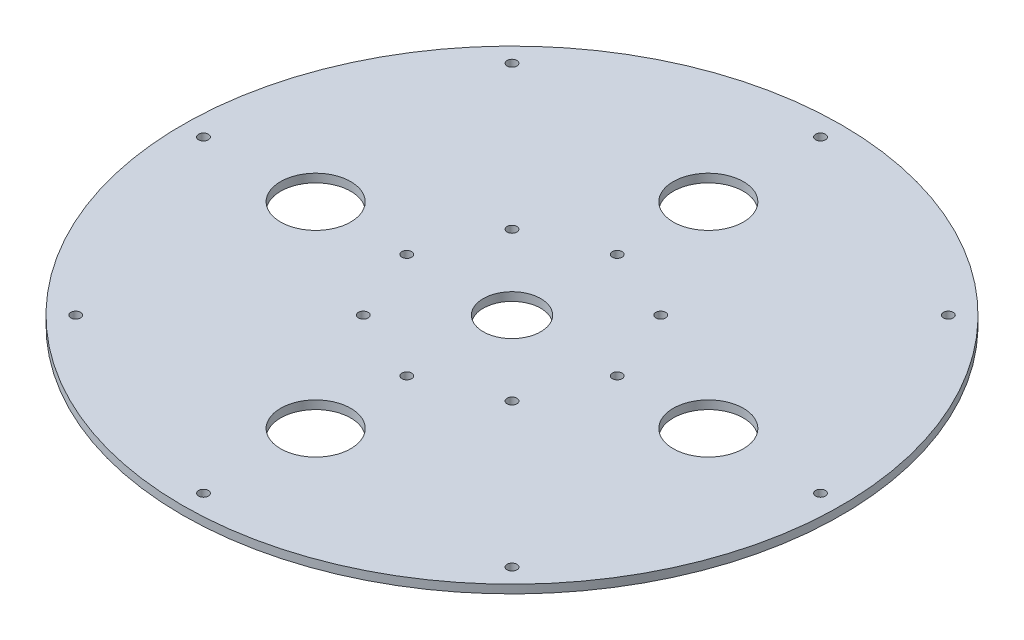
ISO-10303-21;
HEADER;
FILE_DESCRIPTION(('STEP AP214'),'2;1');
FILE_NAME('part.step','',(''),(''),'','','');
FILE_SCHEMA(('AUTOMOTIVE_DESIGN { 1 0 10303 214 1 1 1 1 }'));
ENDSEC;
DATA;
#1=APPLICATION_CONTEXT('core data for automotive mechanical design processes');
#2=APPLICATION_PROTOCOL_DEFINITION('international standard','automotive_design',2000,#1);
#3=PRODUCT_CONTEXT('',#1,'mechanical');
#4=PRODUCT('Part','Part','',(#3));
#5=PRODUCT_RELATED_PRODUCT_CATEGORY('part','',(#4));
#6=PRODUCT_DEFINITION_FORMATION('','',#4);
#7=PRODUCT_DEFINITION_CONTEXT('part definition',#1,'design');
#8=PRODUCT_DEFINITION('design','',#6,#7);
#9=PRODUCT_DEFINITION_SHAPE('','',#8);
#10=(LENGTH_UNIT() NAMED_UNIT(*) SI_UNIT(.MILLI.,.METRE.));
#11=(NAMED_UNIT(*) PLANE_ANGLE_UNIT() SI_UNIT($,.RADIAN.));
#12=(NAMED_UNIT(*) SI_UNIT($,.STERADIAN.) SOLID_ANGLE_UNIT());
#13=UNCERTAINTY_MEASURE_WITH_UNIT(LENGTH_MEASURE(1.E-05),#10,'distance_accuracy_value','');
#14=(GEOMETRIC_REPRESENTATION_CONTEXT(3) GLOBAL_UNCERTAINTY_ASSIGNED_CONTEXT((#13)) GLOBAL_UNIT_ASSIGNED_CONTEXT((#10,
#11,#12)) REPRESENTATION_CONTEXT('',''));
#15=CARTESIAN_POINT('',(0.,0.,0.));
#16=DIRECTION('',(0.,0.,1.));
#17=DIRECTION('',(1.,0.,0.));
#18=AXIS2_PLACEMENT_3D('',#15,#16,#17);
#19=CARTESIAN_POINT('',(0.,1.5,0.));
#20=DIRECTION('',(0.,1.,0.));
#21=DIRECTION('',(0.,0.,1.));
#22=AXIS2_PLACEMENT_3D('',#19,#20,#21);
#23=PLANE('',#22);
#24=CARTESIAN_POINT('',(-37.4999999999985,1.5,1.731707090407E-12));
#25=DIRECTION('',(0.,1.,0.));
#26=DIRECTION('',(0.,0.,1.));
#27=AXIS2_PLACEMENT_3D('',#24,#25,#26);
#28=CIRCLE('',#27,1.75);
#29=CARTESIAN_POINT('',(-37.4999999999985,1.5,1.75000000000174));
#30=VERTEX_POINT('',#29);
#31=EDGE_CURVE('E155',#30,#30,#28,.T.);
#32=ORIENTED_EDGE('',*,*,#31,.F.);
#33=EDGE_LOOP('',(#32));
#34=FACE_BOUND('',#33,.T.);
#35=CARTESIAN_POINT('',(0.,1.5,37.5));
#36=DIRECTION('',(0.,1.,0.));
#37=DIRECTION('',(0.,0.,1.));
#38=AXIS2_PLACEMENT_3D('',#35,#36,#37);
#39=CIRCLE('',#38,1.75000000000317);
#40=CARTESIAN_POINT('',(0.,1.5,39.2500000000032));
#41=VERTEX_POINT('',#40);
#42=EDGE_CURVE('E143',#41,#41,#39,.T.);
#43=ORIENTED_EDGE('',*,*,#42,.F.);
#44=EDGE_LOOP('',(#43));
#45=FACE_BOUND('',#44,.T.);
#46=CARTESIAN_POINT('',(37.5000000000016,1.5,-1.7271146649102E-12));
#47=DIRECTION('',(0.,1.,0.));
#48=DIRECTION('',(0.,0.,1.));
#49=AXIS2_PLACEMENT_3D('',#46,#47,#48);
#50=CIRCLE('',#49,1.75);
#51=CARTESIAN_POINT('',(37.5000000000016,1.5,1.74999999999828));
#52=VERTEX_POINT('',#51);
#53=EDGE_CURVE('E131',#52,#52,#50,.T.);
#54=ORIENTED_EDGE('',*,*,#53,.F.);
#55=EDGE_LOOP('',(#54));
#56=FACE_BOUND('',#55,.T.);
#57=CARTESIAN_POINT('',(-70.,1.5,0.));
#58=DIRECTION('',(0.,1.,0.));
#59=DIRECTION('',(0.,0.,1.));
#60=AXIS2_PLACEMENT_3D('',#57,#58,#59);
#61=CIRCLE('',#60,12.5000000000047);
#62=CARTESIAN_POINT('',(-70.,1.5,12.5000000000047));
#63=VERTEX_POINT('',#62);
#64=EDGE_CURVE('E119',#63,#63,#61,.T.);
#65=ORIENTED_EDGE('',*,*,#64,.F.);
#66=EDGE_LOOP('',(#65));
#67=FACE_BOUND('',#66,.T.);
#68=CARTESIAN_POINT('',(70.,1.5,0.));
#69=DIRECTION('',(0.,1.,0.));
#70=DIRECTION('',(0.,0.,1.));
#71=AXIS2_PLACEMENT_3D('',#68,#69,#70);
#72=CIRCLE('',#71,12.5000000000043);
#73=CARTESIAN_POINT('',(70.,1.5,12.5000000000043));
#74=VERTEX_POINT('',#73);
#75=EDGE_CURVE('E107',#74,#74,#72,.T.);
#76=ORIENTED_EDGE('',*,*,#75,.F.);
#77=EDGE_LOOP('',(#76));
#78=FACE_BOUND('',#77,.T.);
#79=CARTESIAN_POINT('',(-77.7817459305189,1.5,-77.7817459305169));
#80=DIRECTION('',(0.,1.,0.));
#81=DIRECTION('',(0.,0.,1.));
#82=AXIS2_PLACEMENT_3D('',#79,#80,#81);
#83=CIRCLE('',#82,1.75);
#84=CARTESIAN_POINT('',(-77.7817459305189,1.5,-76.0317459305169));
#85=VERTEX_POINT('',#84);
#86=EDGE_CURVE('E95',#85,#85,#83,.T.);
#87=ORIENTED_EDGE('',*,*,#86,.F.);
#88=EDGE_LOOP('',(#87));
#89=FACE_BOUND('',#88,.T.);
#90=CARTESIAN_POINT('',(-77.7817459305122,1.5,77.7817459305235));
#91=DIRECTION('',(0.,1.,0.));
#92=DIRECTION('',(0.,0.,1.));
#93=AXIS2_PLACEMENT_3D('',#90,#91,#92);
#94=CIRCLE('',#93,1.75);
#95=CARTESIAN_POINT('',(-77.7817459305122,1.5,79.5317459305235));
#96=VERTEX_POINT('',#95);
#97=EDGE_CURVE('E83',#96,#96,#94,.T.);
#98=ORIENTED_EDGE('',*,*,#97,.F.);
#99=EDGE_LOOP('',(#98));
#100=FACE_BOUND('',#99,.T.);
#101=CARTESIAN_POINT('',(77.7817459305282,1.5,77.7817459305169));
#102=DIRECTION('',(0.,1.,0.));
#103=DIRECTION('',(0.,0.,1.));
#104=AXIS2_PLACEMENT_3D('',#101,#102,#103);
#105=CIRCLE('',#104,1.75);
#106=CARTESIAN_POINT('',(77.7817459305282,1.5,79.5317459305169));
#107=VERTEX_POINT('',#106);
#108=EDGE_CURVE('E71',#107,#107,#105,.T.);
#109=ORIENTED_EDGE('',*,*,#108,.F.);
#110=EDGE_LOOP('',(#109));
#111=FACE_BOUND('',#110,.T.);
#112=CARTESIAN_POINT('',(0.,1.5,-110.));
#113=DIRECTION('',(0.,1.,0.));
#114=DIRECTION('',(0.,0.,1.));
#115=AXIS2_PLACEMENT_3D('',#112,#113,#114);
#116=CIRCLE('',#115,1.75);
#117=CARTESIAN_POINT('',(0.,1.5,-108.25));
#118=VERTEX_POINT('',#117);
#119=EDGE_CURVE('E59',#118,#118,#116,.T.);
#120=ORIENTED_EDGE('',*,*,#119,.F.);
#121=EDGE_LOOP('',(#120));
#122=FACE_BOUND('',#121,.T.);
#123=CARTESIAN_POINT('',(-1.37011057800065E-13,1.5,-37.5));
#124=DIRECTION('',(0.,1.,0.));
#125=DIRECTION('',(0.,0.,1.));
#126=AXIS2_PLACEMENT_3D('',#123,#124,#125);
#127=CIRCLE('',#126,1.75);
#128=CARTESIAN_POINT('',(-1.37011057800065E-13,1.5,-35.75));
#129=VERTEX_POINT('',#128);
#130=EDGE_CURVE('E47',#129,#129,#127,.T.);
#131=ORIENTED_EDGE('',*,*,#130,.F.);
#132=EDGE_LOOP('',(#131));
#133=FACE_BOUND('',#132,.T.);
#134=CARTESIAN_POINT('',(0.,1.5,0.));
#135=DIRECTION('',(0.,1.,0.));
#136=DIRECTION('',(0.,0.,1.));
#137=AXIS2_PLACEMENT_3D('',#134,#135,#136);
#138=CIRCLE('',#137,117.5);
#139=CARTESIAN_POINT('',(0.,1.5,117.5));
#140=VERTEX_POINT('',#139);
#141=EDGE_CURVE('E10',#140,#140,#138,.T.);
#142=ORIENTED_EDGE('',*,*,#141,.T.);
#143=EDGE_LOOP('',(#142));
#144=FACE_BOUND('',#143,.T.);
#145=CARTESIAN_POINT('',(0.,1.5,0.));
#146=DIRECTION('',(0.,1.,0.));
#147=DIRECTION('',(0.,0.,1.));
#148=AXIS2_PLACEMENT_3D('',#145,#146,#147);
#149=CIRCLE('',#148,10.25);
#150=CARTESIAN_POINT('',(0.,1.5,10.25));
#151=VERTEX_POINT('',#150);
#152=EDGE_CURVE('E42',#151,#151,#149,.T.);
#153=ORIENTED_EDGE('',*,*,#152,.F.);
#154=EDGE_LOOP('',(#153));
#155=FACE_BOUND('',#154,.T.);
#156=CARTESIAN_POINT('',(77.7817459305216,1.5,-77.7817459305235));
#157=DIRECTION('',(0.,1.,0.));
#158=DIRECTION('',(0.,0.,1.));
#159=AXIS2_PLACEMENT_3D('',#156,#157,#158);
#160=CIRCLE('',#159,1.75);
#161=CARTESIAN_POINT('',(77.7817459305216,1.5,-76.0317459305235));
#162=VERTEX_POINT('',#161);
#163=EDGE_CURVE('E53',#162,#162,#160,.T.);
#164=ORIENTED_EDGE('',*,*,#163,.F.);
#165=EDGE_LOOP('',(#164));
#166=FACE_BOUND('',#165,.T.);
#167=CARTESIAN_POINT('',(110.000000000005,1.5,-4.66937538383073E-12));
#168=DIRECTION('',(0.,1.,0.));
#169=DIRECTION('',(0.,0.,1.));
#170=AXIS2_PLACEMENT_3D('',#167,#168,#169);
#171=CIRCLE('',#170,1.75);
#172=CARTESIAN_POINT('',(110.000000000005,1.5,1.74999999999533));
#173=VERTEX_POINT('',#172);
#174=EDGE_CURVE('E65',#173,#173,#171,.T.);
#175=ORIENTED_EDGE('',*,*,#174,.F.);
#176=EDGE_LOOP('',(#175));
#177=FACE_BOUND('',#176,.T.);
#178=CARTESIAN_POINT('',(9.33875076766146E-12,1.5,110.));
#179=DIRECTION('',(0.,1.,0.));
#180=DIRECTION('',(0.,0.,1.));
#181=AXIS2_PLACEMENT_3D('',#178,#179,#180);
#182=CIRCLE('',#181,1.75);
#183=CARTESIAN_POINT('',(9.33875076766146E-12,1.5,111.75));
#184=VERTEX_POINT('',#183);
#185=EDGE_CURVE('E77',#184,#184,#182,.T.);
#186=ORIENTED_EDGE('',*,*,#185,.F.);
#187=EDGE_LOOP('',(#186));
#188=FACE_BOUND('',#187,.T.);
#189=CARTESIAN_POINT('',(-109.999999999995,1.5,4.68284649862135E-12));
#190=DIRECTION('',(0.,1.,0.));
#191=DIRECTION('',(0.,0.,1.));
#192=AXIS2_PLACEMENT_3D('',#189,#190,#191);
#193=CIRCLE('',#192,1.75);
#194=CARTESIAN_POINT('',(-109.999999999995,1.5,1.75000000000468));
#195=VERTEX_POINT('',#194);
#196=EDGE_CURVE('E89',#195,#195,#193,.T.);
#197=ORIENTED_EDGE('',*,*,#196,.F.);
#198=EDGE_LOOP('',(#197));
#199=FACE_BOUND('',#198,.T.);
#200=CARTESIAN_POINT('',(0.,1.5,-70.));
#201=DIRECTION('',(0.,1.,0.));
#202=DIRECTION('',(0.,0.,1.));
#203=AXIS2_PLACEMENT_3D('',#200,#201,#202);
#204=CIRCLE('',#203,12.5000000000047);
#205=CARTESIAN_POINT('',(0.,1.5,-57.4999999999953));
#206=VERTEX_POINT('',#205);
#207=EDGE_CURVE('E101',#206,#206,#204,.T.);
#208=ORIENTED_EDGE('',*,*,#207,.F.);
#209=EDGE_LOOP('',(#208));
#210=FACE_BOUND('',#209,.T.);
#211=CARTESIAN_POINT('',(0.,1.5,70.));
#212=DIRECTION('',(0.,1.,0.));
#213=DIRECTION('',(0.,0.,1.));
#214=AXIS2_PLACEMENT_3D('',#211,#212,#213);
#215=CIRCLE('',#214,12.5000000000045);
#216=CARTESIAN_POINT('',(0.,1.5,82.5000000000045));
#217=VERTEX_POINT('',#216);
#218=EDGE_CURVE('E113',#217,#217,#215,.T.);
#219=ORIENTED_EDGE('',*,*,#218,.F.);
#220=EDGE_LOOP('',(#219));
#221=FACE_BOUND('',#220,.T.);
#222=CARTESIAN_POINT('',(26.5165042944959,1.5,-26.5165042944968));
#223=DIRECTION('',(0.,1.,0.));
#224=DIRECTION('',(0.,0.,1.));
#225=AXIS2_PLACEMENT_3D('',#222,#223,#224);
#226=CIRCLE('',#225,1.75);
#227=CARTESIAN_POINT('',(26.5165042944959,1.5,-24.7665042944968));
#228=VERTEX_POINT('',#227);
#229=EDGE_CURVE('E125',#228,#228,#226,.T.);
#230=ORIENTED_EDGE('',*,*,#229,.F.);
#231=EDGE_LOOP('',(#230));
#232=FACE_BOUND('',#231,.T.);
#233=CARTESIAN_POINT('',(26.5165042944955,1.5,26.5165042944955));
#234=DIRECTION('',(0.,1.,0.));
#235=DIRECTION('',(0.,0.,1.));
#236=AXIS2_PLACEMENT_3D('',#233,#234,#235);
#237=CIRCLE('',#236,1.75000000000307);
#238=CARTESIAN_POINT('',(26.5165042944955,1.5,28.2665042944986));
#239=VERTEX_POINT('',#238);
#240=EDGE_CURVE('E137',#239,#239,#237,.T.);
#241=ORIENTED_EDGE('',*,*,#240,.F.);
#242=EDGE_LOOP('',(#241));
#243=FACE_BOUND('',#242,.T.);
#244=CARTESIAN_POINT('',(-26.5165042944928,1.5,26.5165042944968));
#245=DIRECTION('',(0.,1.,0.));
#246=DIRECTION('',(0.,0.,1.));
#247=AXIS2_PLACEMENT_3D('',#244,#245,#246);
#248=CIRCLE('',#247,1.75);
#249=CARTESIAN_POINT('',(-26.5165042944928,1.5,28.2665042944968));
#250=VERTEX_POINT('',#249);
#251=EDGE_CURVE('E149',#250,#250,#248,.T.);
#252=ORIENTED_EDGE('',*,*,#251,.F.);
#253=EDGE_LOOP('',(#252));
#254=FACE_BOUND('',#253,.T.);
#255=CARTESIAN_POINT('',(-26.5165042944952,1.5,-26.5165042944943));
#256=DIRECTION('',(0.,1.,0.));
#257=DIRECTION('',(0.,0.,1.));
#258=AXIS2_PLACEMENT_3D('',#255,#256,#257);
#259=CIRCLE('',#258,1.75);
#260=CARTESIAN_POINT('',(-26.5165042944952,1.5,-24.7665042944943));
#261=VERTEX_POINT('',#260);
#262=EDGE_CURVE('E161',#261,#261,#259,.T.);
#263=ORIENTED_EDGE('',*,*,#262,.F.);
#264=EDGE_LOOP('',(#263));
#265=FACE_BOUND('',#264,.T.);
#266=ADVANCED_FACE('F31',(#34,#45,#56,#67,#78,#89,#100,#111,#122,#133,#144,#155,#166,#177,#188,
#199,#210,#221,#232,#243,#254,#265),#23,.T.);
#267=CARTESIAN_POINT('',(0.,-1.5,0.));
#268=DIRECTION('',(0.,1.,0.));
#269=DIRECTION('',(0.,0.,1.));
#270=AXIS2_PLACEMENT_3D('',#267,#268,#269);
#271=PLANE('',#270);
#272=CARTESIAN_POINT('',(0.,-1.5,0.));
#273=DIRECTION('',(0.,1.,0.));
#274=DIRECTION('',(0.,0.,1.));
#275=AXIS2_PLACEMENT_3D('',#272,#273,#274);
#276=CIRCLE('',#275,117.5);
#277=CARTESIAN_POINT('',(0.,-1.5,117.5));
#278=VERTEX_POINT('',#277);
#279=EDGE_CURVE('E35',#278,#278,#276,.T.);
#280=ORIENTED_EDGE('',*,*,#279,.F.);
#281=EDGE_LOOP('',(#280));
#282=FACE_BOUND('',#281,.T.);
#283=CARTESIAN_POINT('',(0.,-1.5,0.));
#284=DIRECTION('',(0.,1.,0.));
#285=DIRECTION('',(0.,0.,1.));
#286=AXIS2_PLACEMENT_3D('',#283,#284,#285);
#287=CIRCLE('',#286,10.25);
#288=CARTESIAN_POINT('',(0.,-1.5,10.25));
#289=VERTEX_POINT('',#288);
#290=EDGE_CURVE('E44',#289,#289,#287,.T.);
#291=ORIENTED_EDGE('',*,*,#290,.T.);
#292=EDGE_LOOP('',(#291));
#293=FACE_BOUND('',#292,.T.);
#294=CARTESIAN_POINT('',(-1.37011057800065E-13,-1.5,-37.5));
#295=DIRECTION('',(0.,1.,0.));
#296=DIRECTION('',(0.,0.,1.));
#297=AXIS2_PLACEMENT_3D('',#294,#295,#296);
#298=CIRCLE('',#297,1.75);
#299=CARTESIAN_POINT('',(-1.37011057800065E-13,-1.5,-35.75));
#300=VERTEX_POINT('',#299);
#301=EDGE_CURVE('E50',#300,#300,#298,.T.);
#302=ORIENTED_EDGE('',*,*,#301,.T.);
#303=EDGE_LOOP('',(#302));
#304=FACE_BOUND('',#303,.T.);
#305=CARTESIAN_POINT('',(77.7817459305216,-1.5,-77.7817459305235));
#306=DIRECTION('',(0.,1.,0.));
#307=DIRECTION('',(0.,0.,1.));
#308=AXIS2_PLACEMENT_3D('',#305,#306,#307);
#309=CIRCLE('',#308,1.75);
#310=CARTESIAN_POINT('',(77.7817459305216,-1.5,-76.0317459305235));
#311=VERTEX_POINT('',#310);
#312=EDGE_CURVE('E56',#311,#311,#309,.T.);
#313=ORIENTED_EDGE('',*,*,#312,.T.);
#314=EDGE_LOOP('',(#313));
#315=FACE_BOUND('',#314,.T.);
#316=CARTESIAN_POINT('',(0.,-1.5,-110.));
#317=DIRECTION('',(0.,1.,0.));
#318=DIRECTION('',(0.,0.,1.));
#319=AXIS2_PLACEMENT_3D('',#316,#317,#318);
#320=CIRCLE('',#319,1.75);
#321=CARTESIAN_POINT('',(0.,-1.5,-108.25));
#322=VERTEX_POINT('',#321);
#323=EDGE_CURVE('E62',#322,#322,#320,.T.);
#324=ORIENTED_EDGE('',*,*,#323,.T.);
#325=EDGE_LOOP('',(#324));
#326=FACE_BOUND('',#325,.T.);
#327=CARTESIAN_POINT('',(110.000000000005,-1.5,-4.66937538383073E-12));
#328=DIRECTION('',(0.,1.,0.));
#329=DIRECTION('',(0.,0.,1.));
#330=AXIS2_PLACEMENT_3D('',#327,#328,#329);
#331=CIRCLE('',#330,1.75);
#332=CARTESIAN_POINT('',(110.000000000005,-1.5,1.74999999999533));
#333=VERTEX_POINT('',#332);
#334=EDGE_CURVE('E68',#333,#333,#331,.T.);
#335=ORIENTED_EDGE('',*,*,#334,.T.);
#336=EDGE_LOOP('',(#335));
#337=FACE_BOUND('',#336,.T.);
#338=CARTESIAN_POINT('',(77.7817459305282,-1.5,77.7817459305169));
#339=DIRECTION('',(0.,1.,0.));
#340=DIRECTION('',(0.,0.,1.));
#341=AXIS2_PLACEMENT_3D('',#338,#339,#340);
#342=CIRCLE('',#341,1.75);
#343=CARTESIAN_POINT('',(77.7817459305282,-1.5,79.5317459305169));
#344=VERTEX_POINT('',#343);
#345=EDGE_CURVE('E74',#344,#344,#342,.T.);
#346=ORIENTED_EDGE('',*,*,#345,.T.);
#347=EDGE_LOOP('',(#346));
#348=FACE_BOUND('',#347,.T.);
#349=CARTESIAN_POINT('',(9.33875076766146E-12,-1.5,110.));
#350=DIRECTION('',(0.,1.,0.));
#351=DIRECTION('',(0.,0.,1.));
#352=AXIS2_PLACEMENT_3D('',#349,#350,#351);
#353=CIRCLE('',#352,1.75);
#354=CARTESIAN_POINT('',(9.33875076766146E-12,-1.5,111.75));
#355=VERTEX_POINT('',#354);
#356=EDGE_CURVE('E80',#355,#355,#353,.T.);
#357=ORIENTED_EDGE('',*,*,#356,.T.);
#358=EDGE_LOOP('',(#357));
#359=FACE_BOUND('',#358,.T.);
#360=CARTESIAN_POINT('',(-77.7817459305122,-1.5,77.7817459305235));
#361=DIRECTION('',(0.,1.,0.));
#362=DIRECTION('',(0.,0.,1.));
#363=AXIS2_PLACEMENT_3D('',#360,#361,#362);
#364=CIRCLE('',#363,1.75);
#365=CARTESIAN_POINT('',(-77.7817459305122,-1.5,79.5317459305235));
#366=VERTEX_POINT('',#365);
#367=EDGE_CURVE('E86',#366,#366,#364,.T.);
#368=ORIENTED_EDGE('',*,*,#367,.T.);
#369=EDGE_LOOP('',(#368));
#370=FACE_BOUND('',#369,.T.);
#371=CARTESIAN_POINT('',(-109.999999999995,-1.5,4.68284649862135E-12));
#372=DIRECTION('',(0.,1.,0.));
#373=DIRECTION('',(0.,0.,1.));
#374=AXIS2_PLACEMENT_3D('',#371,#372,#373);
#375=CIRCLE('',#374,1.75);
#376=CARTESIAN_POINT('',(-109.999999999995,-1.5,1.75000000000468));
#377=VERTEX_POINT('',#376);
#378=EDGE_CURVE('E92',#377,#377,#375,.T.);
#379=ORIENTED_EDGE('',*,*,#378,.T.);
#380=EDGE_LOOP('',(#379));
#381=FACE_BOUND('',#380,.T.);
#382=CARTESIAN_POINT('',(-77.7817459305189,-1.5,-77.7817459305169));
#383=DIRECTION('',(0.,1.,0.));
#384=DIRECTION('',(0.,0.,1.));
#385=AXIS2_PLACEMENT_3D('',#382,#383,#384);
#386=CIRCLE('',#385,1.75);
#387=CARTESIAN_POINT('',(-77.7817459305189,-1.5,-76.0317459305169));
#388=VERTEX_POINT('',#387);
#389=EDGE_CURVE('E98',#388,#388,#386,.T.);
#390=ORIENTED_EDGE('',*,*,#389,.T.);
#391=EDGE_LOOP('',(#390));
#392=FACE_BOUND('',#391,.T.);
#393=CARTESIAN_POINT('',(0.,-1.5,-70.));
#394=DIRECTION('',(0.,1.,0.));
#395=DIRECTION('',(0.,0.,1.));
#396=AXIS2_PLACEMENT_3D('',#393,#394,#395);
#397=CIRCLE('',#396,12.5000000000047);
#398=CARTESIAN_POINT('',(0.,-1.5,-57.4999999999953));
#399=VERTEX_POINT('',#398);
#400=EDGE_CURVE('E104',#399,#399,#397,.T.);
#401=ORIENTED_EDGE('',*,*,#400,.T.);
#402=EDGE_LOOP('',(#401));
#403=FACE_BOUND('',#402,.T.);
#404=CARTESIAN_POINT('',(70.,-1.5,0.));
#405=DIRECTION('',(0.,1.,0.));
#406=DIRECTION('',(0.,0.,1.));
#407=AXIS2_PLACEMENT_3D('',#404,#405,#406);
#408=CIRCLE('',#407,12.5000000000043);
#409=CARTESIAN_POINT('',(70.,-1.5,12.5000000000043));
#410=VERTEX_POINT('',#409);
#411=EDGE_CURVE('E110',#410,#410,#408,.T.);
#412=ORIENTED_EDGE('',*,*,#411,.T.);
#413=EDGE_LOOP('',(#412));
#414=FACE_BOUND('',#413,.T.);
#415=CARTESIAN_POINT('',(0.,-1.5,70.));
#416=DIRECTION('',(0.,1.,0.));
#417=DIRECTION('',(0.,0.,1.));
#418=AXIS2_PLACEMENT_3D('',#415,#416,#417);
#419=CIRCLE('',#418,12.5000000000045);
#420=CARTESIAN_POINT('',(0.,-1.5,82.5000000000045));
#421=VERTEX_POINT('',#420);
#422=EDGE_CURVE('E116',#421,#421,#419,.T.);
#423=ORIENTED_EDGE('',*,*,#422,.T.);
#424=EDGE_LOOP('',(#423));
#425=FACE_BOUND('',#424,.T.);
#426=CARTESIAN_POINT('',(-70.,-1.5,0.));
#427=DIRECTION('',(0.,1.,0.));
#428=DIRECTION('',(0.,0.,1.));
#429=AXIS2_PLACEMENT_3D('',#426,#427,#428);
#430=CIRCLE('',#429,12.5000000000047);
#431=CARTESIAN_POINT('',(-70.,-1.5,12.5000000000047));
#432=VERTEX_POINT('',#431);
#433=EDGE_CURVE('E122',#432,#432,#430,.T.);
#434=ORIENTED_EDGE('',*,*,#433,.T.);
#435=EDGE_LOOP('',(#434));
#436=FACE_BOUND('',#435,.T.);
#437=CARTESIAN_POINT('',(26.5165042944959,-1.5,-26.5165042944968));
#438=DIRECTION('',(0.,1.,0.));
#439=DIRECTION('',(0.,0.,1.));
#440=AXIS2_PLACEMENT_3D('',#437,#438,#439);
#441=CIRCLE('',#440,1.75);
#442=CARTESIAN_POINT('',(26.5165042944959,-1.5,-24.7665042944968));
#443=VERTEX_POINT('',#442);
#444=EDGE_CURVE('E128',#443,#443,#441,.T.);
#445=ORIENTED_EDGE('',*,*,#444,.T.);
#446=EDGE_LOOP('',(#445));
#447=FACE_BOUND('',#446,.T.);
#448=CARTESIAN_POINT('',(37.5000000000016,-1.5,-1.7271146649102E-12));
#449=DIRECTION('',(0.,1.,0.));
#450=DIRECTION('',(0.,0.,1.));
#451=AXIS2_PLACEMENT_3D('',#448,#449,#450);
#452=CIRCLE('',#451,1.75);
#453=CARTESIAN_POINT('',(37.5000000000016,-1.5,1.74999999999828));
#454=VERTEX_POINT('',#453);
#455=EDGE_CURVE('E134',#454,#454,#452,.T.);
#456=ORIENTED_EDGE('',*,*,#455,.T.);
#457=EDGE_LOOP('',(#456));
#458=FACE_BOUND('',#457,.T.);
#459=CARTESIAN_POINT('',(26.5165042944955,-1.5,26.5165042944955));
#460=DIRECTION('',(0.,1.,0.));
#461=DIRECTION('',(0.,0.,1.));
#462=AXIS2_PLACEMENT_3D('',#459,#460,#461);
#463=CIRCLE('',#462,1.75000000000307);
#464=CARTESIAN_POINT('',(26.5165042944955,-1.5,28.2665042944986));
#465=VERTEX_POINT('',#464);
#466=EDGE_CURVE('E140',#465,#465,#463,.T.);
#467=ORIENTED_EDGE('',*,*,#466,.T.);
#468=EDGE_LOOP('',(#467));
#469=FACE_BOUND('',#468,.T.);
#470=CARTESIAN_POINT('',(0.,-1.5,37.5));
#471=DIRECTION('',(0.,1.,0.));
#472=DIRECTION('',(0.,0.,1.));
#473=AXIS2_PLACEMENT_3D('',#470,#471,#472);
#474=CIRCLE('',#473,1.75000000000317);
#475=CARTESIAN_POINT('',(0.,-1.5,39.2500000000032));
#476=VERTEX_POINT('',#475);
#477=EDGE_CURVE('E146',#476,#476,#474,.T.);
#478=ORIENTED_EDGE('',*,*,#477,.T.);
#479=EDGE_LOOP('',(#478));
#480=FACE_BOUND('',#479,.T.);
#481=CARTESIAN_POINT('',(-26.5165042944928,-1.5,26.5165042944968));
#482=DIRECTION('',(0.,1.,0.));
#483=DIRECTION('',(0.,0.,1.));
#484=AXIS2_PLACEMENT_3D('',#481,#482,#483);
#485=CIRCLE('',#484,1.75);
#486=CARTESIAN_POINT('',(-26.5165042944928,-1.5,28.2665042944968));
#487=VERTEX_POINT('',#486);
#488=EDGE_CURVE('E152',#487,#487,#485,.T.);
#489=ORIENTED_EDGE('',*,*,#488,.T.);
#490=EDGE_LOOP('',(#489));
#491=FACE_BOUND('',#490,.T.);
#492=CARTESIAN_POINT('',(-37.4999999999985,-1.5,1.731707090407E-12));
#493=DIRECTION('',(0.,1.,0.));
#494=DIRECTION('',(0.,0.,1.));
#495=AXIS2_PLACEMENT_3D('',#492,#493,#494);
#496=CIRCLE('',#495,1.75);
#497=CARTESIAN_POINT('',(-37.4999999999985,-1.5,1.75000000000174));
#498=VERTEX_POINT('',#497);
#499=EDGE_CURVE('E158',#498,#498,#496,.T.);
#500=ORIENTED_EDGE('',*,*,#499,.T.);
#501=EDGE_LOOP('',(#500));
#502=FACE_BOUND('',#501,.T.);
#503=CARTESIAN_POINT('',(-26.5165042944952,-1.5,-26.5165042944943));
#504=DIRECTION('',(0.,1.,0.));
#505=DIRECTION('',(0.,0.,1.));
#506=AXIS2_PLACEMENT_3D('',#503,#504,#505);
#507=CIRCLE('',#506,1.75);
#508=CARTESIAN_POINT('',(-26.5165042944952,-1.5,-24.7665042944943));
#509=VERTEX_POINT('',#508);
#510=EDGE_CURVE('E164',#509,#509,#507,.T.);
#511=ORIENTED_EDGE('',*,*,#510,.T.);
#512=EDGE_LOOP('',(#511));
#513=FACE_BOUND('',#512,.T.);
#514=ADVANCED_FACE('F174',(#282,#293,#304,#315,#326,#337,#348,#359,#370,#381,#392,#403,#414,
#425,#436,#447,#458,#469,#480,#491,#502,#513),#271,.F.);
#515=CARTESIAN_POINT('',(0.,1.5,0.));
#516=DIRECTION('',(0.,-1.,0.));
#517=DIRECTION('',(0.,0.,-1.));
#518=AXIS2_PLACEMENT_3D('',#515,#516,#517);
#519=CYLINDRICAL_SURFACE('',#518,117.5);
#520=ORIENTED_EDGE('',*,*,#141,.F.);
#521=EDGE_LOOP('',(#520));
#522=FACE_BOUND('',#521,.T.);
#523=ORIENTED_EDGE('',*,*,#279,.T.);
#524=EDGE_LOOP('',(#523));
#525=FACE_BOUND('',#524,.T.);
#526=ADVANCED_FACE('F33',(#522,#525),#519,.T.);
#527=CARTESIAN_POINT('',(0.,1.5,0.));
#528=DIRECTION('',(0.,-1.,0.));
#529=DIRECTION('',(0.,0.,-1.));
#530=AXIS2_PLACEMENT_3D('',#527,#528,#529);
#531=CYLINDRICAL_SURFACE('',#530,10.25);
#532=ORIENTED_EDGE('',*,*,#152,.T.);
#533=EDGE_LOOP('',(#532));
#534=FACE_BOUND('',#533,.T.);
#535=ORIENTED_EDGE('',*,*,#290,.F.);
#536=EDGE_LOOP('',(#535));
#537=FACE_BOUND('',#536,.T.);
#538=ADVANCED_FACE('F184',(#534,#537),#531,.F.);
#539=CARTESIAN_POINT('',(-1.37011057800065E-13,1.5,-37.5));
#540=DIRECTION('',(0.,-1.,0.));
#541=DIRECTION('',(0.,0.,-1.));
#542=AXIS2_PLACEMENT_3D('',#539,#540,#541);
#543=CYLINDRICAL_SURFACE('',#542,1.75);
#544=ORIENTED_EDGE('',*,*,#130,.T.);
#545=EDGE_LOOP('',(#544));
#546=FACE_BOUND('',#545,.T.);
#547=ORIENTED_EDGE('',*,*,#301,.F.);
#548=EDGE_LOOP('',(#547));
#549=FACE_BOUND('',#548,.T.);
#550=ADVANCED_FACE('F187',(#546,#549),#543,.F.);
#551=CARTESIAN_POINT('',(77.7817459305216,1.5,-77.7817459305235));
#552=DIRECTION('',(0.,-1.,0.));
#553=DIRECTION('',(0.,0.,-1.));
#554=AXIS2_PLACEMENT_3D('',#551,#552,#553);
#555=CYLINDRICAL_SURFACE('',#554,1.75);
#556=ORIENTED_EDGE('',*,*,#163,.T.);
#557=EDGE_LOOP('',(#556));
#558=FACE_BOUND('',#557,.T.);
#559=ORIENTED_EDGE('',*,*,#312,.F.);
#560=EDGE_LOOP('',(#559));
#561=FACE_BOUND('',#560,.T.);
#562=ADVANCED_FACE('F191',(#558,#561),#555,.F.);
#563=CARTESIAN_POINT('',(0.,1.5,-110.));
#564=DIRECTION('',(0.,-1.,0.));
#565=DIRECTION('',(0.,0.,-1.));
#566=AXIS2_PLACEMENT_3D('',#563,#564,#565);
#567=CYLINDRICAL_SURFACE('',#566,1.75);
#568=ORIENTED_EDGE('',*,*,#119,.T.);
#569=EDGE_LOOP('',(#568));
#570=FACE_BOUND('',#569,.T.);
#571=ORIENTED_EDGE('',*,*,#323,.F.);
#572=EDGE_LOOP('',(#571));
#573=FACE_BOUND('',#572,.T.);
#574=ADVANCED_FACE('F195',(#570,#573),#567,.F.);
#575=CARTESIAN_POINT('',(110.000000000005,1.5,-4.66937538383073E-12));
#576=DIRECTION('',(0.,-1.,0.));
#577=DIRECTION('',(0.,0.,-1.));
#578=AXIS2_PLACEMENT_3D('',#575,#576,#577);
#579=CYLINDRICAL_SURFACE('',#578,1.75);
#580=ORIENTED_EDGE('',*,*,#174,.T.);
#581=EDGE_LOOP('',(#580));
#582=FACE_BOUND('',#581,.T.);
#583=ORIENTED_EDGE('',*,*,#334,.F.);
#584=EDGE_LOOP('',(#583));
#585=FACE_BOUND('',#584,.T.);
#586=ADVANCED_FACE('F199',(#582,#585),#579,.F.);
#587=CARTESIAN_POINT('',(77.7817459305282,1.5,77.7817459305169));
#588=DIRECTION('',(0.,-1.,0.));
#589=DIRECTION('',(0.,0.,-1.));
#590=AXIS2_PLACEMENT_3D('',#587,#588,#589);
#591=CYLINDRICAL_SURFACE('',#590,1.75);
#592=ORIENTED_EDGE('',*,*,#108,.T.);
#593=EDGE_LOOP('',(#592));
#594=FACE_BOUND('',#593,.T.);
#595=ORIENTED_EDGE('',*,*,#345,.F.);
#596=EDGE_LOOP('',(#595));
#597=FACE_BOUND('',#596,.T.);
#598=ADVANCED_FACE('F203',(#594,#597),#591,.F.);
#599=CARTESIAN_POINT('',(9.33875076766146E-12,1.5,110.));
#600=DIRECTION('',(0.,-1.,0.));
#601=DIRECTION('',(0.,0.,-1.));
#602=AXIS2_PLACEMENT_3D('',#599,#600,#601);
#603=CYLINDRICAL_SURFACE('',#602,1.75);
#604=ORIENTED_EDGE('',*,*,#185,.T.);
#605=EDGE_LOOP('',(#604));
#606=FACE_BOUND('',#605,.T.);
#607=ORIENTED_EDGE('',*,*,#356,.F.);
#608=EDGE_LOOP('',(#607));
#609=FACE_BOUND('',#608,.T.);
#610=ADVANCED_FACE('F207',(#606,#609),#603,.F.);
#611=CARTESIAN_POINT('',(-77.7817459305122,1.5,77.7817459305235));
#612=DIRECTION('',(0.,-1.,0.));
#613=DIRECTION('',(0.,0.,-1.));
#614=AXIS2_PLACEMENT_3D('',#611,#612,#613);
#615=CYLINDRICAL_SURFACE('',#614,1.75);
#616=ORIENTED_EDGE('',*,*,#97,.T.);
#617=EDGE_LOOP('',(#616));
#618=FACE_BOUND('',#617,.T.);
#619=ORIENTED_EDGE('',*,*,#367,.F.);
#620=EDGE_LOOP('',(#619));
#621=FACE_BOUND('',#620,.T.);
#622=ADVANCED_FACE('F211',(#618,#621),#615,.F.);
#623=CARTESIAN_POINT('',(-109.999999999995,1.5,4.68284649862135E-12));
#624=DIRECTION('',(0.,-1.,0.));
#625=DIRECTION('',(0.,0.,-1.));
#626=AXIS2_PLACEMENT_3D('',#623,#624,#625);
#627=CYLINDRICAL_SURFACE('',#626,1.75);
#628=ORIENTED_EDGE('',*,*,#196,.T.);
#629=EDGE_LOOP('',(#628));
#630=FACE_BOUND('',#629,.T.);
#631=ORIENTED_EDGE('',*,*,#378,.F.);
#632=EDGE_LOOP('',(#631));
#633=FACE_BOUND('',#632,.T.);
#634=ADVANCED_FACE('F215',(#630,#633),#627,.F.);
#635=CARTESIAN_POINT('',(-77.7817459305189,1.5,-77.7817459305169));
#636=DIRECTION('',(0.,-1.,0.));
#637=DIRECTION('',(0.,0.,-1.));
#638=AXIS2_PLACEMENT_3D('',#635,#636,#637);
#639=CYLINDRICAL_SURFACE('',#638,1.75);
#640=ORIENTED_EDGE('',*,*,#86,.T.);
#641=EDGE_LOOP('',(#640));
#642=FACE_BOUND('',#641,.T.);
#643=ORIENTED_EDGE('',*,*,#389,.F.);
#644=EDGE_LOOP('',(#643));
#645=FACE_BOUND('',#644,.T.);
#646=ADVANCED_FACE('F219',(#642,#645),#639,.F.);
#647=CARTESIAN_POINT('',(0.,1.5,-70.));
#648=DIRECTION('',(0.,-1.,0.));
#649=DIRECTION('',(0.,0.,-1.));
#650=AXIS2_PLACEMENT_3D('',#647,#648,#649);
#651=CYLINDRICAL_SURFACE('',#650,12.5000000000047);
#652=ORIENTED_EDGE('',*,*,#207,.T.);
#653=EDGE_LOOP('',(#652));
#654=FACE_BOUND('',#653,.T.);
#655=ORIENTED_EDGE('',*,*,#400,.F.);
#656=EDGE_LOOP('',(#655));
#657=FACE_BOUND('',#656,.T.);
#658=ADVANCED_FACE('F223',(#654,#657),#651,.F.);
#659=CARTESIAN_POINT('',(70.,1.5,0.));
#660=DIRECTION('',(0.,-1.,0.));
#661=DIRECTION('',(0.,0.,-1.));
#662=AXIS2_PLACEMENT_3D('',#659,#660,#661);
#663=CYLINDRICAL_SURFACE('',#662,12.5000000000043);
#664=ORIENTED_EDGE('',*,*,#75,.T.);
#665=EDGE_LOOP('',(#664));
#666=FACE_BOUND('',#665,.T.);
#667=ORIENTED_EDGE('',*,*,#411,.F.);
#668=EDGE_LOOP('',(#667));
#669=FACE_BOUND('',#668,.T.);
#670=ADVANCED_FACE('F227',(#666,#669),#663,.F.);
#671=CARTESIAN_POINT('',(0.,1.5,70.));
#672=DIRECTION('',(0.,-1.,0.));
#673=DIRECTION('',(0.,0.,-1.));
#674=AXIS2_PLACEMENT_3D('',#671,#672,#673);
#675=CYLINDRICAL_SURFACE('',#674,12.5000000000045);
#676=ORIENTED_EDGE('',*,*,#218,.T.);
#677=EDGE_LOOP('',(#676));
#678=FACE_BOUND('',#677,.T.);
#679=ORIENTED_EDGE('',*,*,#422,.F.);
#680=EDGE_LOOP('',(#679));
#681=FACE_BOUND('',#680,.T.);
#682=ADVANCED_FACE('F231',(#678,#681),#675,.F.);
#683=CARTESIAN_POINT('',(-70.,1.5,0.));
#684=DIRECTION('',(0.,-1.,0.));
#685=DIRECTION('',(0.,0.,-1.));
#686=AXIS2_PLACEMENT_3D('',#683,#684,#685);
#687=CYLINDRICAL_SURFACE('',#686,12.5000000000047);
#688=ORIENTED_EDGE('',*,*,#64,.T.);
#689=EDGE_LOOP('',(#688));
#690=FACE_BOUND('',#689,.T.);
#691=ORIENTED_EDGE('',*,*,#433,.F.);
#692=EDGE_LOOP('',(#691));
#693=FACE_BOUND('',#692,.T.);
#694=ADVANCED_FACE('F235',(#690,#693),#687,.F.);
#695=CARTESIAN_POINT('',(26.5165042944959,1.5,-26.5165042944968));
#696=DIRECTION('',(0.,-1.,0.));
#697=DIRECTION('',(0.,0.,-1.));
#698=AXIS2_PLACEMENT_3D('',#695,#696,#697);
#699=CYLINDRICAL_SURFACE('',#698,1.75);
#700=ORIENTED_EDGE('',*,*,#229,.T.);
#701=EDGE_LOOP('',(#700));
#702=FACE_BOUND('',#701,.T.);
#703=ORIENTED_EDGE('',*,*,#444,.F.);
#704=EDGE_LOOP('',(#703));
#705=FACE_BOUND('',#704,.T.);
#706=ADVANCED_FACE('F239',(#702,#705),#699,.F.);
#707=CARTESIAN_POINT('',(37.5000000000016,1.5,-1.7271146649102E-12));
#708=DIRECTION('',(0.,-1.,0.));
#709=DIRECTION('',(0.,0.,-1.));
#710=AXIS2_PLACEMENT_3D('',#707,#708,#709);
#711=CYLINDRICAL_SURFACE('',#710,1.75);
#712=ORIENTED_EDGE('',*,*,#53,.T.);
#713=EDGE_LOOP('',(#712));
#714=FACE_BOUND('',#713,.T.);
#715=ORIENTED_EDGE('',*,*,#455,.F.);
#716=EDGE_LOOP('',(#715));
#717=FACE_BOUND('',#716,.T.);
#718=ADVANCED_FACE('F243',(#714,#717),#711,.F.);
#719=CARTESIAN_POINT('',(26.5165042944955,1.5,26.5165042944955));
#720=DIRECTION('',(0.,-1.,0.));
#721=DIRECTION('',(0.,0.,-1.));
#722=AXIS2_PLACEMENT_3D('',#719,#720,#721);
#723=CYLINDRICAL_SURFACE('',#722,1.75000000000307);
#724=ORIENTED_EDGE('',*,*,#240,.T.);
#725=EDGE_LOOP('',(#724));
#726=FACE_BOUND('',#725,.T.);
#727=ORIENTED_EDGE('',*,*,#466,.F.);
#728=EDGE_LOOP('',(#727));
#729=FACE_BOUND('',#728,.T.);
#730=ADVANCED_FACE('F247',(#726,#729),#723,.F.);
#731=CARTESIAN_POINT('',(0.,1.5,37.5));
#732=DIRECTION('',(0.,-1.,0.));
#733=DIRECTION('',(0.,0.,-1.));
#734=AXIS2_PLACEMENT_3D('',#731,#732,#733);
#735=CYLINDRICAL_SURFACE('',#734,1.75000000000317);
#736=ORIENTED_EDGE('',*,*,#42,.T.);
#737=EDGE_LOOP('',(#736));
#738=FACE_BOUND('',#737,.T.);
#739=ORIENTED_EDGE('',*,*,#477,.F.);
#740=EDGE_LOOP('',(#739));
#741=FACE_BOUND('',#740,.T.);
#742=ADVANCED_FACE('F251',(#738,#741),#735,.F.);
#743=CARTESIAN_POINT('',(-26.5165042944928,1.5,26.5165042944968));
#744=DIRECTION('',(0.,-1.,0.));
#745=DIRECTION('',(0.,0.,-1.));
#746=AXIS2_PLACEMENT_3D('',#743,#744,#745);
#747=CYLINDRICAL_SURFACE('',#746,1.75);
#748=ORIENTED_EDGE('',*,*,#251,.T.);
#749=EDGE_LOOP('',(#748));
#750=FACE_BOUND('',#749,.T.);
#751=ORIENTED_EDGE('',*,*,#488,.F.);
#752=EDGE_LOOP('',(#751));
#753=FACE_BOUND('',#752,.T.);
#754=ADVANCED_FACE('F255',(#750,#753),#747,.F.);
#755=CARTESIAN_POINT('',(-37.4999999999985,1.5,1.731707090407E-12));
#756=DIRECTION('',(0.,-1.,0.));
#757=DIRECTION('',(0.,0.,-1.));
#758=AXIS2_PLACEMENT_3D('',#755,#756,#757);
#759=CYLINDRICAL_SURFACE('',#758,1.75);
#760=ORIENTED_EDGE('',*,*,#31,.T.);
#761=EDGE_LOOP('',(#760));
#762=FACE_BOUND('',#761,.T.);
#763=ORIENTED_EDGE('',*,*,#499,.F.);
#764=EDGE_LOOP('',(#763));
#765=FACE_BOUND('',#764,.T.);
#766=ADVANCED_FACE('F259',(#762,#765),#759,.F.);
#767=CARTESIAN_POINT('',(-26.5165042944952,1.5,-26.5165042944943));
#768=DIRECTION('',(0.,-1.,0.));
#769=DIRECTION('',(0.,0.,-1.));
#770=AXIS2_PLACEMENT_3D('',#767,#768,#769);
#771=CYLINDRICAL_SURFACE('',#770,1.75);
#772=ORIENTED_EDGE('',*,*,#262,.T.);
#773=EDGE_LOOP('',(#772));
#774=FACE_BOUND('',#773,.T.);
#775=ORIENTED_EDGE('',*,*,#510,.F.);
#776=EDGE_LOOP('',(#775));
#777=FACE_BOUND('',#776,.T.);
#778=ADVANCED_FACE('F170',(#774,#777),#771,.F.);
#779=CLOSED_SHELL('',(#266,#514,#526,#538,#550,#562,#574,#586,#598,#610,#622,#634,#646,#658,
#670,#682,#694,#706,#718,#730,#742,#754,#766,#778));
#780=MANIFOLD_SOLID_BREP('B2',#779);
#781=ADVANCED_BREP_SHAPE_REPRESENTATION('',(#18,#780),#14);
#782=SHAPE_DEFINITION_REPRESENTATION(#9,#781);
ENDSEC;
END-ISO-10303-21;
